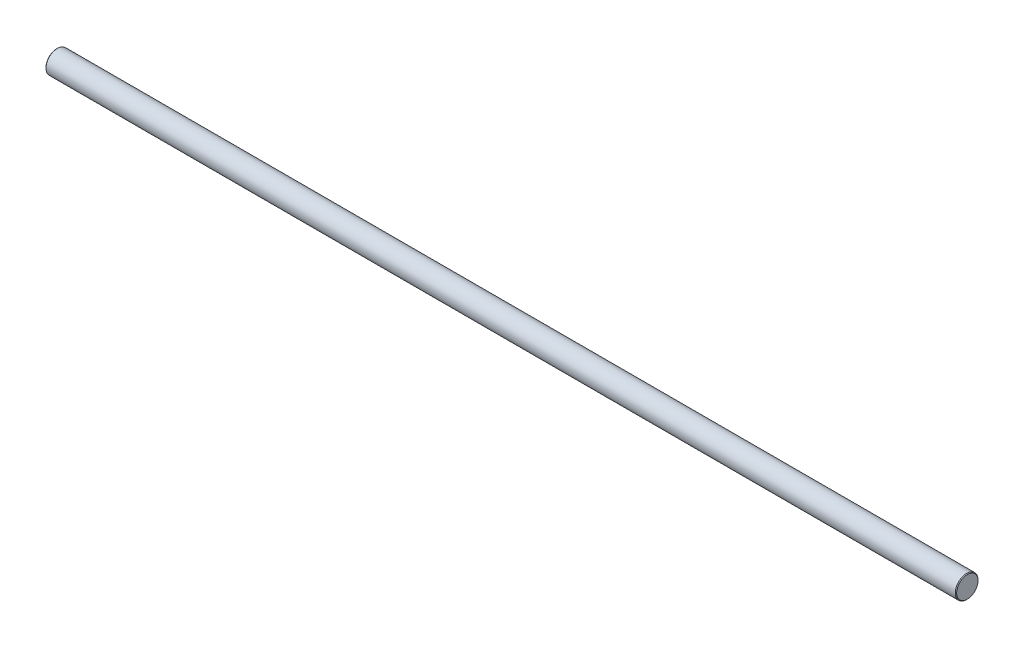
ISO-10303-21;
HEADER;
FILE_DESCRIPTION(('STEP AP214'),'2;1');
FILE_NAME('part.step','',(''),(''),'','','');
FILE_SCHEMA(('AUTOMOTIVE_DESIGN { 1 0 10303 214 1 1 1 1 }'));
ENDSEC;
DATA;
#1=APPLICATION_CONTEXT('core data for automotive mechanical design processes');
#2=APPLICATION_PROTOCOL_DEFINITION('international standard','automotive_design',2000,#1);
#3=PRODUCT_CONTEXT('',#1,'mechanical');
#4=PRODUCT('Part','Part','',(#3));
#5=PRODUCT_RELATED_PRODUCT_CATEGORY('part','',(#4));
#6=PRODUCT_DEFINITION_FORMATION('','',#4);
#7=PRODUCT_DEFINITION_CONTEXT('part definition',#1,'design');
#8=PRODUCT_DEFINITION('design','',#6,#7);
#9=PRODUCT_DEFINITION_SHAPE('','',#8);
#10=(LENGTH_UNIT() NAMED_UNIT(*) SI_UNIT(.MILLI.,.METRE.));
#11=(NAMED_UNIT(*) PLANE_ANGLE_UNIT() SI_UNIT($,.RADIAN.));
#12=(NAMED_UNIT(*) SI_UNIT($,.STERADIAN.) SOLID_ANGLE_UNIT());
#13=UNCERTAINTY_MEASURE_WITH_UNIT(LENGTH_MEASURE(1.E-05),#10,'distance_accuracy_value','');
#14=(GEOMETRIC_REPRESENTATION_CONTEXT(3) GLOBAL_UNCERTAINTY_ASSIGNED_CONTEXT((#13)) GLOBAL_UNIT_ASSIGNED_CONTEXT((#10,
#11,#12)) REPRESENTATION_CONTEXT('',''));
#15=CARTESIAN_POINT('',(0.,0.,0.));
#16=DIRECTION('',(0.,0.,1.));
#17=DIRECTION('',(1.,0.,0.));
#18=AXIS2_PLACEMENT_3D('',#15,#16,#17);
#19=CARTESIAN_POINT('',(0.,0.,0.));
#20=DIRECTION('',(1.,0.,0.));
#21=DIRECTION('',(0.,0.,-1.));
#22=AXIS2_PLACEMENT_3D('',#19,#20,#21);
#23=PLANE('',#22);
#24=CARTESIAN_POINT('',(0.,0.,0.));
#25=DIRECTION('',(-1.,0.,0.));
#26=DIRECTION('',(0.,0.,1.));
#27=AXIS2_PLACEMENT_3D('',#24,#25,#26);
#28=CIRCLE('',#27,7.5);
#29=CARTESIAN_POINT('',(0.,0.,7.5));
#30=VERTEX_POINT('',#29);
#31=EDGE_CURVE('E10',#30,#30,#28,.T.);
#32=ORIENTED_EDGE('',*,*,#31,.T.);
#33=EDGE_LOOP('',(#32));
#34=FACE_BOUND('',#33,.T.);
#35=ADVANCED_FACE('F31',(#34),#23,.F.);
#36=CARTESIAN_POINT('',(0.499999999999945,0.,0.));
#37=DIRECTION('',(1.,0.,0.));
#38=DIRECTION('',(0.,0.,-1.));
#39=AXIS2_PLACEMENT_3D('',#36,#37,#38);
#40=CONICAL_SURFACE('',#39,8.,0.785398163397504);
#41=ORIENTED_EDGE('',*,*,#31,.F.);
#42=EDGE_LOOP('',(#41));
#43=FACE_BOUND('',#42,.T.);
#44=CARTESIAN_POINT('',(0.499999999999945,0.,0.));
#45=DIRECTION('',(-1.,0.,0.));
#46=DIRECTION('',(0.,0.,1.));
#47=AXIS2_PLACEMENT_3D('',#44,#45,#46);
#48=CIRCLE('',#47,8.);
#49=CARTESIAN_POINT('',(0.499999999999945,0.,8.));
#50=VERTEX_POINT('',#49);
#51=EDGE_CURVE('E37',#50,#50,#48,.T.);
#52=ORIENTED_EDGE('',*,*,#51,.T.);
#53=EDGE_LOOP('',(#52));
#54=FACE_BOUND('',#53,.T.);
#55=ADVANCED_FACE('F63',(#43,#54),#40,.T.);
#56=CARTESIAN_POINT('',(640.,0.,0.));
#57=DIRECTION('',(-1.,0.,0.));
#58=DIRECTION('',(0.,0.,1.));
#59=AXIS2_PLACEMENT_3D('',#56,#57,#58);
#60=CYLINDRICAL_SURFACE('',#59,8.);
#61=ORIENTED_EDGE('',*,*,#51,.F.);
#62=EDGE_LOOP('',(#61));
#63=FACE_BOUND('',#62,.T.);
#64=CARTESIAN_POINT('',(639.5,0.,0.));
#65=DIRECTION('',(-1.,0.,0.));
#66=DIRECTION('',(0.,0.,1.));
#67=AXIS2_PLACEMENT_3D('',#64,#65,#66);
#68=CIRCLE('',#67,8.);
#69=CARTESIAN_POINT('',(639.5,0.,8.));
#70=VERTEX_POINT('',#69);
#71=EDGE_CURVE('E41',#70,#70,#68,.T.);
#72=ORIENTED_EDGE('',*,*,#71,.T.);
#73=EDGE_LOOP('',(#72));
#74=FACE_BOUND('',#73,.T.);
#75=ADVANCED_FACE('F59',(#63,#74),#60,.T.);
#76=CARTESIAN_POINT('',(640.,0.,0.));
#77=DIRECTION('',(-1.,0.,0.));
#78=DIRECTION('',(0.,0.,1.));
#79=AXIS2_PLACEMENT_3D('',#76,#77,#78);
#80=CONICAL_SURFACE('',#79,7.5,0.785398163397393);
#81=ORIENTED_EDGE('',*,*,#71,.F.);
#82=EDGE_LOOP('',(#81));
#83=FACE_BOUND('',#82,.T.);
#84=CARTESIAN_POINT('',(640.,0.,0.));
#85=DIRECTION('',(-1.,0.,0.));
#86=DIRECTION('',(0.,0.,1.));
#87=AXIS2_PLACEMENT_3D('',#84,#85,#86);
#88=CIRCLE('',#87,7.5);
#89=CARTESIAN_POINT('',(640.,0.,7.5));
#90=VERTEX_POINT('',#89);
#91=EDGE_CURVE('E45',#90,#90,#88,.T.);
#92=ORIENTED_EDGE('',*,*,#91,.T.);
#93=EDGE_LOOP('',(#92));
#94=FACE_BOUND('',#93,.T.);
#95=ADVANCED_FACE('F51',(#83,#94),#80,.T.);
#96=CARTESIAN_POINT('',(640.,7.5,0.));
#97=DIRECTION('',(-1.,0.,0.));
#98=DIRECTION('',(0.,0.,1.));
#99=AXIS2_PLACEMENT_3D('',#96,#97,#98);
#100=PLANE('',#99);
#101=ORIENTED_EDGE('',*,*,#91,.F.);
#102=EDGE_LOOP('',(#101));
#103=FACE_BOUND('',#102,.T.);
#104=ADVANCED_FACE('F53',(#103),#100,.F.);
#105=CLOSED_SHELL('',(#35,#55,#75,#95,#104));
#106=MANIFOLD_SOLID_BREP('B2',#105);
#107=ADVANCED_BREP_SHAPE_REPRESENTATION('',(#18,#106),#14);
#108=SHAPE_DEFINITION_REPRESENTATION(#9,#107);
ENDSEC;
END-ISO-10303-21;
